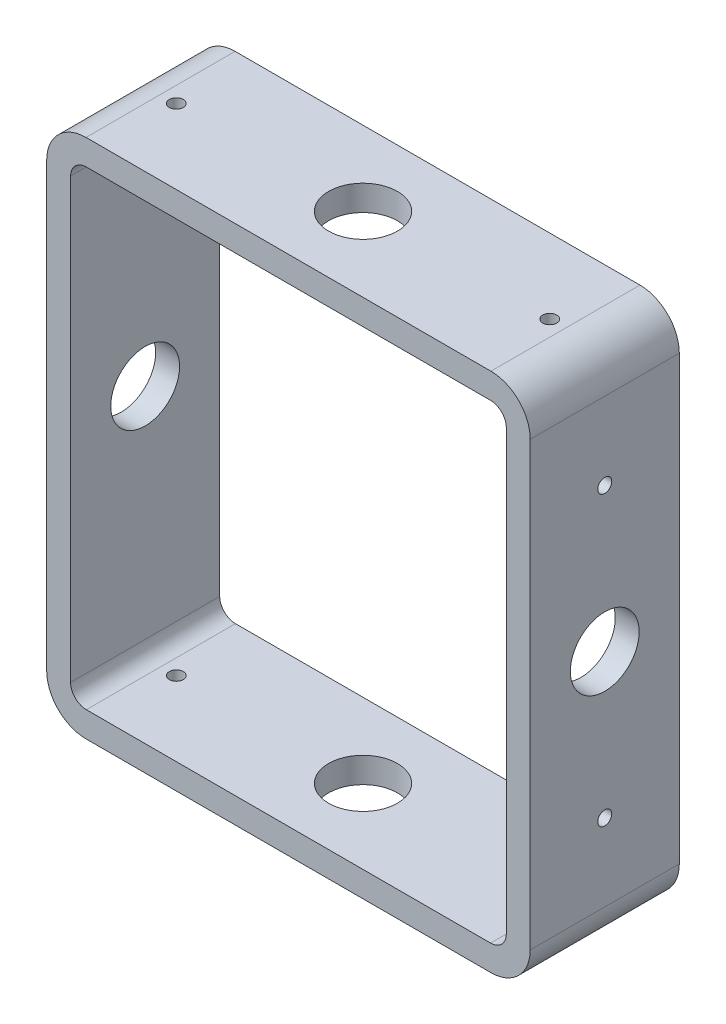
ISO-10303-21;
HEADER;
FILE_DESCRIPTION(('STEP AP214'),'2;1');
FILE_NAME('part.step','',(''),(''),'','','');
FILE_SCHEMA(('AUTOMOTIVE_DESIGN { 1 0 10303 214 1 1 1 1 }'));
ENDSEC;
DATA;
#1=APPLICATION_CONTEXT('core data for automotive mechanical design processes');
#2=APPLICATION_PROTOCOL_DEFINITION('international standard','automotive_design',2000,#1);
#3=PRODUCT_CONTEXT('',#1,'mechanical');
#4=PRODUCT('Part','Part','',(#3));
#5=PRODUCT_RELATED_PRODUCT_CATEGORY('part','',(#4));
#6=PRODUCT_DEFINITION_FORMATION('','',#4);
#7=PRODUCT_DEFINITION_CONTEXT('part definition',#1,'design');
#8=PRODUCT_DEFINITION('design','',#6,#7);
#9=PRODUCT_DEFINITION_SHAPE('','',#8);
#10=(LENGTH_UNIT() NAMED_UNIT(*) SI_UNIT(.MILLI.,.METRE.));
#11=(NAMED_UNIT(*) PLANE_ANGLE_UNIT() SI_UNIT($,.RADIAN.));
#12=(NAMED_UNIT(*) SI_UNIT($,.STERADIAN.) SOLID_ANGLE_UNIT());
#13=UNCERTAINTY_MEASURE_WITH_UNIT(LENGTH_MEASURE(1.E-05),#10,'distance_accuracy_value','');
#14=(GEOMETRIC_REPRESENTATION_CONTEXT(3) GLOBAL_UNCERTAINTY_ASSIGNED_CONTEXT((#13)) GLOBAL_UNIT_ASSIGNED_CONTEXT((#10,
#11,#12)) REPRESENTATION_CONTEXT('',''));
#15=CARTESIAN_POINT('',(0.,0.,0.));
#16=DIRECTION('',(0.,0.,1.));
#17=DIRECTION('',(1.,0.,0.));
#18=AXIS2_PLACEMENT_3D('',#15,#16,#17);
#19=CARTESIAN_POINT('',(-39.0271,-42.04335,24.0665));
#20=DIRECTION('',(0.,1.,0.));
#21=DIRECTION('',(0.,0.,1.));
#22=AXIS2_PLACEMENT_3D('',#19,#20,#21);
#23=PLANE('',#22);
#24=CARTESIAN_POINT('',(30.1371,-42.04335,12.03325));
#25=DIRECTION('',(0.,-1.,0.));
#26=DIRECTION('',(0.,0.,-1.));
#27=AXIS2_PLACEMENT_3D('',#24,#25,#26);
#28=CIRCLE('',#27,1.13029999999999);
#29=CARTESIAN_POINT('',(30.1371,-42.04335,10.90295));
#30=VERTEX_POINT('',#29);
#31=EDGE_CURVE('E554',#30,#30,#28,.T.);
#32=ORIENTED_EDGE('',*,*,#31,.F.);
#33=EDGE_LOOP('',(#32));
#34=FACE_BOUND('',#33,.T.);
#35=CARTESIAN_POINT('',(0.,-42.04335,12.03325));
#36=DIRECTION('',(0.,1.,0.));
#37=DIRECTION('',(0.,0.,1.));
#38=AXIS2_PLACEMENT_3D('',#35,#36,#37);
#39=CIRCLE('',#38,5.55624999999999);
#40=CARTESIAN_POINT('',(0.,-42.04335,17.5895));
#41=VERTEX_POINT('',#40);
#42=EDGE_CURVE('E588',#41,#41,#39,.T.);
#43=ORIENTED_EDGE('',*,*,#42,.T.);
#44=EDGE_LOOP('',(#43));
#45=FACE_BOUND('',#44,.T.);
#46=DIRECTION('',(1.,0.,0.));
#47=VECTOR('',#46,1.);
#48=CARTESIAN_POINT('',(-39.0271,-42.04335,0.));
#49=LINE('',#48,#47);
#50=CARTESIAN_POINT('',(-32.6771,-42.04335,0.));
#51=VERTEX_POINT('',#50);
#52=CARTESIAN_POINT('',(32.6771,-42.04335,0.));
#53=VERTEX_POINT('',#52);
#54=EDGE_CURVE('E201',#51,#53,#49,.T.);
#55=ORIENTED_EDGE('',*,*,#54,.T.);
#56=DIRECTION('',(0.,0.,-1.));
#57=VECTOR('',#56,1.);
#58=CARTESIAN_POINT('',(32.6771,-42.04335,24.0665));
#59=LINE('',#58,#57);
#60=CARTESIAN_POINT('',(32.6771,-42.04335,24.0665));
#61=VERTEX_POINT('',#60);
#62=EDGE_CURVE('E162',#53,#61,#59,.F.);
#63=ORIENTED_EDGE('',*,*,#62,.T.);
#64=DIRECTION('',(1.,0.,0.));
#65=VECTOR('',#64,1.);
#66=CARTESIAN_POINT('',(-39.0271,-42.04335,24.0665));
#67=LINE('',#66,#65);
#68=CARTESIAN_POINT('',(-32.6771,-42.04335,24.0665));
#69=VERTEX_POINT('',#68);
#70=EDGE_CURVE('E196',#69,#61,#67,.T.);
#71=ORIENTED_EDGE('',*,*,#70,.F.);
#72=DIRECTION('',(0.,0.,-1.));
#73=VECTOR('',#72,1.);
#74=CARTESIAN_POINT('',(-32.6771,-42.04335,24.0665));
#75=LINE('',#74,#73);
#76=EDGE_CURVE('E167',#69,#51,#75,.T.);
#77=ORIENTED_EDGE('',*,*,#76,.T.);
#78=EDGE_LOOP('',(#55,#63,#71,#77));
#79=FACE_BOUND('',#78,.T.);
#80=CARTESIAN_POINT('',(-30.1371,-42.04335,12.03325));
#81=DIRECTION('',(0.,-1.,0.));
#82=DIRECTION('',(0.,0.,-1.));
#83=AXIS2_PLACEMENT_3D('',#80,#81,#82);
#84=CIRCLE('',#83,1.13029999999999);
#85=CARTESIAN_POINT('',(-30.1371,-42.04335,10.90295));
#86=VERTEX_POINT('',#85);
#87=EDGE_CURVE('E564',#86,#86,#84,.T.);
#88=ORIENTED_EDGE('',*,*,#87,.F.);
#89=EDGE_LOOP('',(#88));
#90=FACE_BOUND('',#89,.T.);
#91=ADVANCED_FACE('F43',(#34,#45,#79,#90),#23,.F.);
#92=CARTESIAN_POINT('',(39.0271,-42.04335,24.0665));
#93=DIRECTION('',(-1.,0.,0.));
#94=DIRECTION('',(0.,0.,1.));
#95=AXIS2_PLACEMENT_3D('',#92,#93,#94);
#96=PLANE('',#95);
#97=CARTESIAN_POINT('',(39.0271,0.,12.03325));
#98=DIRECTION('',(-1.,0.,0.));
#99=DIRECTION('',(0.,0.,1.));
#100=AXIS2_PLACEMENT_3D('',#97,#98,#99);
#101=CIRCLE('',#100,5.55624999999999);
#102=CARTESIAN_POINT('',(39.0271,0.,17.5895));
#103=VERTEX_POINT('',#102);
#104=EDGE_CURVE('E599',#103,#103,#101,.T.);
#105=ORIENTED_EDGE('',*,*,#104,.T.);
#106=EDGE_LOOP('',(#105));
#107=FACE_BOUND('',#106,.T.);
#108=DIRECTION('',(0.,1.,0.));
#109=VECTOR('',#108,1.);
#110=CARTESIAN_POINT('',(39.0271,-42.04335,24.0665));
#111=LINE('',#110,#109);
#112=CARTESIAN_POINT('',(39.0271,-35.69335,24.0665));
#113=VERTEX_POINT('',#112);
#114=CARTESIAN_POINT('',(39.0271,35.69335,24.0665));
#115=VERTEX_POINT('',#114);
#116=EDGE_CURVE('E178',#113,#115,#111,.T.);
#117=ORIENTED_EDGE('',*,*,#116,.F.);
#118=DIRECTION('',(0.,0.,-1.));
#119=VECTOR('',#118,1.);
#120=CARTESIAN_POINT('',(39.0271,-35.69335,24.0665));
#121=LINE('',#120,#119);
#122=CARTESIAN_POINT('',(39.0271,-35.69335,0.));
#123=VERTEX_POINT('',#122);
#124=EDGE_CURVE('E161',#113,#123,#121,.T.);
#125=ORIENTED_EDGE('',*,*,#124,.T.);
#126=DIRECTION('',(0.,1.,0.));
#127=VECTOR('',#126,1.);
#128=CARTESIAN_POINT('',(39.0271,-42.04335,0.));
#129=LINE('',#128,#127);
#130=CARTESIAN_POINT('',(39.0271,35.69335,0.));
#131=VERTEX_POINT('',#130);
#132=EDGE_CURVE('E175',#123,#131,#129,.T.);
#133=ORIENTED_EDGE('',*,*,#132,.T.);
#134=DIRECTION('',(0.,0.,-1.));
#135=VECTOR('',#134,1.);
#136=CARTESIAN_POINT('',(39.0271,35.69335,24.0665));
#137=LINE('',#136,#135);
#138=EDGE_CURVE('E180',#131,#115,#137,.F.);
#139=ORIENTED_EDGE('',*,*,#138,.T.);
#140=EDGE_LOOP('',(#117,#125,#133,#139));
#141=FACE_BOUND('',#140,.T.);
#142=CARTESIAN_POINT('',(39.0271,-23.241,12.03325));
#143=DIRECTION('',(1.,0.,0.));
#144=DIRECTION('',(0.,0.,-1.));
#145=AXIS2_PLACEMENT_3D('',#142,#143,#144);
#146=CIRCLE('',#145,1.13029999999998);
#147=CARTESIAN_POINT('',(39.0271,-23.241,10.90295));
#148=VERTEX_POINT('',#147);
#149=EDGE_CURVE('E579',#148,#148,#146,.T.);
#150=ORIENTED_EDGE('',*,*,#149,.F.);
#151=EDGE_LOOP('',(#150));
#152=FACE_BOUND('',#151,.T.);
#153=CARTESIAN_POINT('',(39.0271,23.241,12.03325));
#154=DIRECTION('',(1.,0.,0.));
#155=DIRECTION('',(0.,0.,-1.));
#156=AXIS2_PLACEMENT_3D('',#153,#154,#155);
#157=CIRCLE('',#156,1.13029999999998);
#158=CARTESIAN_POINT('',(39.0271,23.241,10.90295));
#159=VERTEX_POINT('',#158);
#160=EDGE_CURVE('E573',#159,#159,#157,.T.);
#161=ORIENTED_EDGE('',*,*,#160,.F.);
#162=EDGE_LOOP('',(#161));
#163=FACE_BOUND('',#162,.T.);
#164=ADVANCED_FACE('F173',(#107,#141,#152,#163),#96,.F.);
#165=CARTESIAN_POINT('',(0.,0.,24.0665));
#166=DIRECTION('',(0.,0.,-1.));
#167=DIRECTION('',(-1.,0.,0.));
#168=AXIS2_PLACEMENT_3D('',#165,#166,#167);
#169=PLANE('',#168);
#170=ORIENTED_EDGE('',*,*,#70,.T.);
#171=CARTESIAN_POINT('',(32.6771,-35.69335,24.0665));
#172=DIRECTION('',(0.,0.,-1.));
#173=DIRECTION('',(-1.,0.,0.));
#174=AXIS2_PLACEMENT_3D('',#171,#172,#173);
#175=CIRCLE('',#174,6.35);
#176=EDGE_CURVE('E216',#61,#113,#175,.F.);
#177=ORIENTED_EDGE('',*,*,#176,.T.);
#178=ORIENTED_EDGE('',*,*,#116,.T.);
#179=CARTESIAN_POINT('',(32.6771,35.69335,24.0665));
#180=DIRECTION('',(0.,0.,-1.));
#181=DIRECTION('',(-1.,0.,0.));
#182=AXIS2_PLACEMENT_3D('',#179,#180,#181);
#183=CIRCLE('',#182,6.35);
#184=CARTESIAN_POINT('',(32.6771,42.04335,24.0665));
#185=VERTEX_POINT('',#184);
#186=EDGE_CURVE('E212',#115,#185,#183,.F.);
#187=ORIENTED_EDGE('',*,*,#186,.T.);
#188=DIRECTION('',(-1.,0.,0.));
#189=VECTOR('',#188,1.);
#190=CARTESIAN_POINT('',(-39.0271,42.04335,24.0665));
#191=LINE('',#190,#189);
#192=CARTESIAN_POINT('',(-32.6771,42.04335,24.0665));
#193=VERTEX_POINT('',#192);
#194=EDGE_CURVE('E292',#185,#193,#191,.T.);
#195=ORIENTED_EDGE('',*,*,#194,.T.);
#196=CARTESIAN_POINT('',(-32.6771,35.69335,24.0665));
#197=DIRECTION('',(0.,0.,-1.));
#198=DIRECTION('',(-1.,0.,0.));
#199=AXIS2_PLACEMENT_3D('',#196,#197,#198);
#200=CIRCLE('',#199,6.35);
#201=CARTESIAN_POINT('',(-39.0271,35.69335,24.0665));
#202=VERTEX_POINT('',#201);
#203=EDGE_CURVE('E210',#193,#202,#200,.F.);
#204=ORIENTED_EDGE('',*,*,#203,.T.);
#205=DIRECTION('',(0.,-1.,0.));
#206=VECTOR('',#205,1.);
#207=CARTESIAN_POINT('',(-39.0271,-42.04335,24.0665));
#208=LINE('',#207,#206);
#209=CARTESIAN_POINT('',(-39.0271,-35.69335,24.0665));
#210=VERTEX_POINT('',#209);
#211=EDGE_CURVE('E294',#202,#210,#208,.T.);
#212=ORIENTED_EDGE('',*,*,#211,.T.);
#213=CARTESIAN_POINT('',(-32.6771,-35.69335,24.0665));
#214=DIRECTION('',(0.,0.,-1.));
#215=DIRECTION('',(-1.,0.,0.));
#216=AXIS2_PLACEMENT_3D('',#213,#214,#215);
#217=CIRCLE('',#216,6.35);
#218=EDGE_CURVE('E214',#210,#69,#217,.F.);
#219=ORIENTED_EDGE('',*,*,#218,.T.);
#220=EDGE_LOOP('',(#170,#177,#178,#187,#195,#204,#212,#219));
#221=FACE_BOUND('',#220,.T.);
#222=DIRECTION('',(0.,1.,0.));
#223=VECTOR('',#222,1.);
#224=CARTESIAN_POINT('',(35.1663,-37.9349,24.0665));
#225=LINE('',#224,#223);
#226=CARTESIAN_POINT('',(35.1663,-35.3949,24.0665));
#227=VERTEX_POINT('',#226);
#228=CARTESIAN_POINT('',(35.1663,35.3949,24.0665));
#229=VERTEX_POINT('',#228);
#230=EDGE_CURVE('E275',#227,#229,#225,.T.);
#231=ORIENTED_EDGE('',*,*,#230,.F.);
#232=CARTESIAN_POINT('',(32.6263,-35.3949,24.0665));
#233=DIRECTION('',(0.,0.,-1.));
#234=DIRECTION('',(-1.,0.,0.));
#235=AXIS2_PLACEMENT_3D('',#232,#233,#234);
#236=CIRCLE('',#235,2.54);
#237=CARTESIAN_POINT('',(32.6263,-37.9349,24.0665));
#238=VERTEX_POINT('',#237);
#239=EDGE_CURVE('E257',#227,#238,#236,.T.);
#240=ORIENTED_EDGE('',*,*,#239,.T.);
#241=DIRECTION('',(1.,0.,0.));
#242=VECTOR('',#241,1.);
#243=CARTESIAN_POINT('',(-35.1663,-37.9349,24.0665));
#244=LINE('',#243,#242);
#245=CARTESIAN_POINT('',(-32.6263,-37.9349,24.0665));
#246=VERTEX_POINT('',#245);
#247=EDGE_CURVE('E187',#246,#238,#244,.T.);
#248=ORIENTED_EDGE('',*,*,#247,.F.);
#249=CARTESIAN_POINT('',(-32.6263,-35.3949,24.0665));
#250=DIRECTION('',(0.,0.,-1.));
#251=DIRECTION('',(-1.,0.,0.));
#252=AXIS2_PLACEMENT_3D('',#249,#250,#251);
#253=CIRCLE('',#252,2.54);
#254=CARTESIAN_POINT('',(-35.1663,-35.3949,24.0665));
#255=VERTEX_POINT('',#254);
#256=EDGE_CURVE('E249',#246,#255,#253,.T.);
#257=ORIENTED_EDGE('',*,*,#256,.T.);
#258=DIRECTION('',(0.,-1.,0.));
#259=VECTOR('',#258,1.);
#260=CARTESIAN_POINT('',(-35.1663,-37.9349,24.0665));
#261=LINE('',#260,#259);
#262=CARTESIAN_POINT('',(-35.1663,35.3949,24.0665));
#263=VERTEX_POINT('',#262);
#264=EDGE_CURVE('E193',#263,#255,#261,.T.);
#265=ORIENTED_EDGE('',*,*,#264,.F.);
#266=CARTESIAN_POINT('',(-32.6263,35.3949,24.0665));
#267=DIRECTION('',(0.,0.,-1.));
#268=DIRECTION('',(-1.,0.,0.));
#269=AXIS2_PLACEMENT_3D('',#266,#267,#268);
#270=CIRCLE('',#269,2.54);
#271=CARTESIAN_POINT('',(-32.6263,37.9349,24.0665));
#272=VERTEX_POINT('',#271);
#273=EDGE_CURVE('E253',#263,#272,#270,.T.);
#274=ORIENTED_EDGE('',*,*,#273,.T.);
#275=DIRECTION('',(-1.,0.,0.));
#276=VECTOR('',#275,1.);
#277=CARTESIAN_POINT('',(-35.1663,37.9349,24.0665));
#278=LINE('',#277,#276);
#279=CARTESIAN_POINT('',(32.6263,37.9349,24.0665));
#280=VERTEX_POINT('',#279);
#281=EDGE_CURVE('E277',#280,#272,#278,.T.);
#282=ORIENTED_EDGE('',*,*,#281,.F.);
#283=CARTESIAN_POINT('',(32.6263,35.3949,24.0665));
#284=DIRECTION('',(0.,0.,-1.));
#285=DIRECTION('',(-1.,0.,0.));
#286=AXIS2_PLACEMENT_3D('',#283,#284,#285);
#287=CIRCLE('',#286,2.54);
#288=EDGE_CURVE('E11',#280,#229,#287,.T.);
#289=ORIENTED_EDGE('',*,*,#288,.T.);
#290=EDGE_LOOP('',(#231,#240,#248,#257,#265,#274,#282,#289));
#291=FACE_BOUND('',#290,.T.);
#292=ADVANCED_FACE('F301',(#221,#291),#169,.F.);
#293=CARTESIAN_POINT('',(0.,0.,0.));
#294=DIRECTION('',(0.,0.,-1.));
#295=DIRECTION('',(-1.,0.,0.));
#296=AXIS2_PLACEMENT_3D('',#293,#294,#295);
#297=PLANE('',#296);
#298=ORIENTED_EDGE('',*,*,#132,.F.);
#299=CARTESIAN_POINT('',(32.6771,-35.69335,0.));
#300=DIRECTION('',(0.,0.,-1.));
#301=DIRECTION('',(-1.,0.,0.));
#302=AXIS2_PLACEMENT_3D('',#299,#300,#301);
#303=CIRCLE('',#302,6.35);
#304=EDGE_CURVE('E157',#123,#53,#303,.T.);
#305=ORIENTED_EDGE('',*,*,#304,.T.);
#306=ORIENTED_EDGE('',*,*,#54,.F.);
#307=CARTESIAN_POINT('',(-32.6771,-35.69335,0.));
#308=DIRECTION('',(0.,0.,-1.));
#309=DIRECTION('',(-1.,0.,0.));
#310=AXIS2_PLACEMENT_3D('',#307,#308,#309);
#311=CIRCLE('',#310,6.35);
#312=CARTESIAN_POINT('',(-39.0271,-35.69335,0.));
#313=VERTEX_POINT('',#312);
#314=EDGE_CURVE('E168',#51,#313,#311,.T.);
#315=ORIENTED_EDGE('',*,*,#314,.T.);
#316=DIRECTION('',(0.,-1.,0.));
#317=VECTOR('',#316,1.);
#318=CARTESIAN_POINT('',(-39.0271,-42.04335,0.));
#319=LINE('',#318,#317);
#320=CARTESIAN_POINT('',(-39.0271,35.69335,0.));
#321=VERTEX_POINT('',#320);
#322=EDGE_CURVE('E190',#321,#313,#319,.T.);
#323=ORIENTED_EDGE('',*,*,#322,.F.);
#324=CARTESIAN_POINT('',(-32.6771,35.69335,0.));
#325=DIRECTION('',(0.,0.,-1.));
#326=DIRECTION('',(-1.,0.,0.));
#327=AXIS2_PLACEMENT_3D('',#324,#325,#326);
#328=CIRCLE('',#327,6.35);
#329=CARTESIAN_POINT('',(-32.6771,42.04335,0.));
#330=VERTEX_POINT('',#329);
#331=EDGE_CURVE('E179',#321,#330,#328,.T.);
#332=ORIENTED_EDGE('',*,*,#331,.T.);
#333=DIRECTION('',(-1.,0.,0.));
#334=VECTOR('',#333,1.);
#335=CARTESIAN_POINT('',(-39.0271,42.04335,0.));
#336=LINE('',#335,#334);
#337=CARTESIAN_POINT('',(32.6771,42.04335,0.));
#338=VERTEX_POINT('',#337);
#339=EDGE_CURVE('E186',#338,#330,#336,.T.);
#340=ORIENTED_EDGE('',*,*,#339,.F.);
#341=CARTESIAN_POINT('',(32.6771,35.69335,0.));
#342=DIRECTION('',(0.,0.,-1.));
#343=DIRECTION('',(-1.,0.,0.));
#344=AXIS2_PLACEMENT_3D('',#341,#342,#343);
#345=CIRCLE('',#344,6.35);
#346=EDGE_CURVE('E185',#338,#131,#345,.T.);
#347=ORIENTED_EDGE('',*,*,#346,.T.);
#348=EDGE_LOOP('',(#298,#305,#306,#315,#323,#332,#340,#347));
#349=FACE_BOUND('',#348,.T.);
#350=DIRECTION('',(0.,-1.,0.));
#351=VECTOR('',#350,1.);
#352=CARTESIAN_POINT('',(-35.1663,-37.9349,0.));
#353=LINE('',#352,#351);
#354=CARTESIAN_POINT('',(-35.1663,35.3949,0.));
#355=VERTEX_POINT('',#354);
#356=CARTESIAN_POINT('',(-35.1663,-35.3949,0.));
#357=VERTEX_POINT('',#356);
#358=EDGE_CURVE('E272',#355,#357,#353,.T.);
#359=ORIENTED_EDGE('',*,*,#358,.T.);
#360=CARTESIAN_POINT('',(-32.6263,-35.3949,0.));
#361=DIRECTION('',(0.,0.,-1.));
#362=DIRECTION('',(-1.,0.,0.));
#363=AXIS2_PLACEMENT_3D('',#360,#361,#362);
#364=CIRCLE('',#363,2.54);
#365=CARTESIAN_POINT('',(-32.6263,-37.9349,0.));
#366=VERTEX_POINT('',#365);
#367=EDGE_CURVE('E247',#357,#366,#364,.F.);
#368=ORIENTED_EDGE('',*,*,#367,.T.);
#369=DIRECTION('',(1.,0.,0.));
#370=VECTOR('',#369,1.);
#371=CARTESIAN_POINT('',(-35.1663,-37.9349,0.));
#372=LINE('',#371,#370);
#373=CARTESIAN_POINT('',(32.6263,-37.9349,0.));
#374=VERTEX_POINT('',#373);
#375=EDGE_CURVE('E278',#366,#374,#372,.T.);
#376=ORIENTED_EDGE('',*,*,#375,.T.);
#377=CARTESIAN_POINT('',(32.6263,-35.3949,0.));
#378=DIRECTION('',(0.,0.,-1.));
#379=DIRECTION('',(-1.,0.,0.));
#380=AXIS2_PLACEMENT_3D('',#377,#378,#379);
#381=CIRCLE('',#380,2.54);
#382=CARTESIAN_POINT('',(35.1663,-35.3949,0.));
#383=VERTEX_POINT('',#382);
#384=EDGE_CURVE('E255',#374,#383,#381,.F.);
#385=ORIENTED_EDGE('',*,*,#384,.T.);
#386=DIRECTION('',(0.,1.,0.));
#387=VECTOR('',#386,1.);
#388=CARTESIAN_POINT('',(35.1663,-37.9349,0.));
#389=LINE('',#388,#387);
#390=CARTESIAN_POINT('',(35.1663,35.3949,0.));
#391=VERTEX_POINT('',#390);
#392=EDGE_CURVE('E264',#383,#391,#389,.T.);
#393=ORIENTED_EDGE('',*,*,#392,.T.);
#394=CARTESIAN_POINT('',(32.6263,35.3949,0.));
#395=DIRECTION('',(0.,0.,-1.));
#396=DIRECTION('',(-1.,0.,0.));
#397=AXIS2_PLACEMENT_3D('',#394,#395,#396);
#398=CIRCLE('',#397,2.54);
#399=CARTESIAN_POINT('',(32.6263,37.9349,0.));
#400=VERTEX_POINT('',#399);
#401=EDGE_CURVE('E52',#391,#400,#398,.F.);
#402=ORIENTED_EDGE('',*,*,#401,.T.);
#403=DIRECTION('',(-1.,0.,0.));
#404=VECTOR('',#403,1.);
#405=CARTESIAN_POINT('',(-35.1663,37.9349,0.));
#406=LINE('',#405,#404);
#407=CARTESIAN_POINT('',(-32.6263,37.9349,0.));
#408=VERTEX_POINT('',#407);
#409=EDGE_CURVE('E263',#400,#408,#406,.T.);
#410=ORIENTED_EDGE('',*,*,#409,.T.);
#411=CARTESIAN_POINT('',(-32.6263,35.3949,0.));
#412=DIRECTION('',(0.,0.,-1.));
#413=DIRECTION('',(-1.,0.,0.));
#414=AXIS2_PLACEMENT_3D('',#411,#412,#413);
#415=CIRCLE('',#414,2.54);
#416=EDGE_CURVE('E251',#408,#355,#415,.F.);
#417=ORIENTED_EDGE('',*,*,#416,.T.);
#418=EDGE_LOOP('',(#359,#368,#376,#385,#393,#402,#410,#417));
#419=FACE_BOUND('',#418,.T.);
#420=ADVANCED_FACE('F182',(#349,#419),#297,.T.);
#421=CARTESIAN_POINT('',(-39.0271,42.04335,24.0665));
#422=DIRECTION('',(0.,-1.,0.));
#423=DIRECTION('',(0.,0.,-1.));
#424=AXIS2_PLACEMENT_3D('',#421,#422,#423);
#425=PLANE('',#424);
#426=CARTESIAN_POINT('',(30.1371,42.04335,12.03325));
#427=DIRECTION('',(0.,-1.,0.));
#428=DIRECTION('',(0.,0.,-1.));
#429=AXIS2_PLACEMENT_3D('',#426,#427,#428);
#430=CIRCLE('',#429,1.13029999999998);
#431=CARTESIAN_POINT('',(30.1371,42.04335,10.90295));
#432=VERTEX_POINT('',#431);
#433=EDGE_CURVE('E555',#432,#432,#430,.T.);
#434=ORIENTED_EDGE('',*,*,#433,.T.);
#435=EDGE_LOOP('',(#434));
#436=FACE_BOUND('',#435,.T.);
#437=CARTESIAN_POINT('',(-30.1371,42.04335,12.03325));
#438=DIRECTION('',(0.,-1.,0.));
#439=DIRECTION('',(0.,0.,-1.));
#440=AXIS2_PLACEMENT_3D('',#437,#438,#439);
#441=CIRCLE('',#440,1.13029999999998);
#442=CARTESIAN_POINT('',(-30.1371,42.04335,10.90295));
#443=VERTEX_POINT('',#442);
#444=EDGE_CURVE('E567',#443,#443,#441,.T.);
#445=ORIENTED_EDGE('',*,*,#444,.T.);
#446=EDGE_LOOP('',(#445));
#447=FACE_BOUND('',#446,.T.);
#448=CARTESIAN_POINT('',(0.,42.04335,12.03325));
#449=DIRECTION('',(0.,1.,0.));
#450=DIRECTION('',(0.,0.,1.));
#451=AXIS2_PLACEMENT_3D('',#448,#449,#450);
#452=CIRCLE('',#451,5.55624999999999);
#453=CARTESIAN_POINT('',(0.,42.04335,17.5895));
#454=VERTEX_POINT('',#453);
#455=EDGE_CURVE('E585',#454,#454,#452,.T.);
#456=ORIENTED_EDGE('',*,*,#455,.F.);
#457=EDGE_LOOP('',(#456));
#458=FACE_BOUND('',#457,.T.);
#459=ORIENTED_EDGE('',*,*,#194,.F.);
#460=DIRECTION('',(0.,0.,-1.));
#461=VECTOR('',#460,1.);
#462=CARTESIAN_POINT('',(32.6771,42.04335,24.0665));
#463=LINE('',#462,#461);
#464=EDGE_CURVE('E225',#185,#338,#463,.T.);
#465=ORIENTED_EDGE('',*,*,#464,.T.);
#466=ORIENTED_EDGE('',*,*,#339,.T.);
#467=DIRECTION('',(0.,0.,-1.));
#468=VECTOR('',#467,1.);
#469=CARTESIAN_POINT('',(-32.6771,42.04335,24.0665));
#470=LINE('',#469,#468);
#471=EDGE_CURVE('E223',#330,#193,#470,.F.);
#472=ORIENTED_EDGE('',*,*,#471,.T.);
#473=EDGE_LOOP('',(#459,#465,#466,#472));
#474=FACE_BOUND('',#473,.T.);
#475=ADVANCED_FACE('F318',(#436,#447,#458,#474),#425,.F.);
#476=CARTESIAN_POINT('',(-39.0271,-42.04335,24.0665));
#477=DIRECTION('',(1.,0.,0.));
#478=DIRECTION('',(0.,0.,-1.));
#479=AXIS2_PLACEMENT_3D('',#476,#477,#478);
#480=PLANE('',#479);
#481=CARTESIAN_POINT('',(-39.0271,0.,12.03325));
#482=DIRECTION('',(-1.,0.,0.));
#483=DIRECTION('',(0.,0.,1.));
#484=AXIS2_PLACEMENT_3D('',#481,#482,#483);
#485=CIRCLE('',#484,5.55624999999999);
#486=CARTESIAN_POINT('',(-39.0271,0.,17.5895));
#487=VERTEX_POINT('',#486);
#488=EDGE_CURVE('E596',#487,#487,#485,.T.);
#489=ORIENTED_EDGE('',*,*,#488,.F.);
#490=EDGE_LOOP('',(#489));
#491=FACE_BOUND('',#490,.T.);
#492=ORIENTED_EDGE('',*,*,#322,.T.);
#493=DIRECTION('',(0.,0.,-1.));
#494=VECTOR('',#493,1.);
#495=CARTESIAN_POINT('',(-39.0271,-35.69335,24.0665));
#496=LINE('',#495,#494);
#497=EDGE_CURVE('E221',#313,#210,#496,.F.);
#498=ORIENTED_EDGE('',*,*,#497,.T.);
#499=ORIENTED_EDGE('',*,*,#211,.F.);
#500=DIRECTION('',(0.,0.,-1.));
#501=VECTOR('',#500,1.);
#502=CARTESIAN_POINT('',(-39.0271,35.69335,24.0665));
#503=LINE('',#502,#501);
#504=EDGE_CURVE('E218',#202,#321,#503,.T.);
#505=ORIENTED_EDGE('',*,*,#504,.T.);
#506=EDGE_LOOP('',(#492,#498,#499,#505));
#507=FACE_BOUND('',#506,.T.);
#508=ADVANCED_FACE('F310',(#491,#507),#480,.F.);
#509=CARTESIAN_POINT('',(35.1663,-37.9349,24.0665));
#510=DIRECTION('',(-1.,0.,0.));
#511=DIRECTION('',(0.,0.,1.));
#512=AXIS2_PLACEMENT_3D('',#509,#510,#511);
#513=PLANE('',#512);
#514=CARTESIAN_POINT('',(35.1663,23.241,12.03325));
#515=DIRECTION('',(-1.,0.,0.));
#516=DIRECTION('',(0.,0.,1.));
#517=AXIS2_PLACEMENT_3D('',#514,#515,#516);
#518=CIRCLE('',#517,1.13029999999999);
#519=CARTESIAN_POINT('',(35.1663,23.241,13.16355));
#520=VERTEX_POINT('',#519);
#521=EDGE_CURVE('E576',#520,#520,#518,.T.);
#522=ORIENTED_EDGE('',*,*,#521,.F.);
#523=EDGE_LOOP('',(#522));
#524=FACE_BOUND('',#523,.T.);
#525=CARTESIAN_POINT('',(35.1663,-23.241,12.03325));
#526=DIRECTION('',(-1.,0.,0.));
#527=DIRECTION('',(0.,0.,1.));
#528=AXIS2_PLACEMENT_3D('',#525,#526,#527);
#529=CIRCLE('',#528,1.13029999999999);
#530=CARTESIAN_POINT('',(35.1663,-23.241,13.16355));
#531=VERTEX_POINT('',#530);
#532=EDGE_CURVE('E582',#531,#531,#529,.T.);
#533=ORIENTED_EDGE('',*,*,#532,.F.);
#534=EDGE_LOOP('',(#533));
#535=FACE_BOUND('',#534,.T.);
#536=CARTESIAN_POINT('',(35.1663,0.,12.03325));
#537=DIRECTION('',(-1.,0.,0.));
#538=DIRECTION('',(0.,0.,1.));
#539=AXIS2_PLACEMENT_3D('',#536,#537,#538);
#540=CIRCLE('',#539,5.55624999999999);
#541=CARTESIAN_POINT('',(35.1663,0.,17.5895));
#542=VERTEX_POINT('',#541);
#543=EDGE_CURVE('E601',#542,#542,#540,.T.);
#544=ORIENTED_EDGE('',*,*,#543,.F.);
#545=EDGE_LOOP('',(#544));
#546=FACE_BOUND('',#545,.T.);
#547=ORIENTED_EDGE('',*,*,#392,.F.);
#548=DIRECTION('',(0.,0.,-1.));
#549=VECTOR('',#548,1.);
#550=CARTESIAN_POINT('',(35.1663,-35.3949,24.0665));
#551=LINE('',#550,#549);
#552=EDGE_CURVE('E64',#383,#227,#551,.F.);
#553=ORIENTED_EDGE('',*,*,#552,.T.);
#554=ORIENTED_EDGE('',*,*,#230,.T.);
#555=DIRECTION('',(0.,0.,-1.));
#556=VECTOR('',#555,1.);
#557=CARTESIAN_POINT('',(35.1663,35.3949,0.));
#558=LINE('',#557,#556);
#559=EDGE_CURVE('E243',#229,#391,#558,.T.);
#560=ORIENTED_EDGE('',*,*,#559,.T.);
#561=EDGE_LOOP('',(#547,#553,#554,#560));
#562=FACE_BOUND('',#561,.T.);
#563=ADVANCED_FACE('F274',(#524,#535,#546,#562),#513,.T.);
#564=CARTESIAN_POINT('',(-35.1663,37.9349,24.0665));
#565=DIRECTION('',(0.,-1.,0.));
#566=DIRECTION('',(0.,0.,-1.));
#567=AXIS2_PLACEMENT_3D('',#564,#565,#566);
#568=PLANE('',#567);
#569=CARTESIAN_POINT('',(30.1371,37.9349,12.03325));
#570=DIRECTION('',(0.,-1.,0.));
#571=DIRECTION('',(0.,0.,-1.));
#572=AXIS2_PLACEMENT_3D('',#569,#570,#571);
#573=CIRCLE('',#572,1.13029999999998);
#574=CARTESIAN_POINT('',(30.1371,37.9349,10.90295));
#575=VERTEX_POINT('',#574);
#576=EDGE_CURVE('E561',#575,#575,#573,.T.);
#577=ORIENTED_EDGE('',*,*,#576,.F.);
#578=EDGE_LOOP('',(#577));
#579=FACE_BOUND('',#578,.T.);
#580=CARTESIAN_POINT('',(-30.1371,37.9349,12.03325));
#581=DIRECTION('',(0.,-1.,0.));
#582=DIRECTION('',(0.,0.,-1.));
#583=AXIS2_PLACEMENT_3D('',#580,#581,#582);
#584=CIRCLE('',#583,1.13029999999999);
#585=CARTESIAN_POINT('',(-30.1371,37.9349,10.90295));
#586=VERTEX_POINT('',#585);
#587=EDGE_CURVE('E570',#586,#586,#584,.T.);
#588=ORIENTED_EDGE('',*,*,#587,.F.);
#589=EDGE_LOOP('',(#588));
#590=FACE_BOUND('',#589,.T.);
#591=CARTESIAN_POINT('',(0.,37.9349,12.03325));
#592=DIRECTION('',(0.,-1.,0.));
#593=DIRECTION('',(0.,0.,-1.));
#594=AXIS2_PLACEMENT_3D('',#591,#592,#593);
#595=CIRCLE('',#594,5.55624999999999);
#596=CARTESIAN_POINT('',(0.,37.9349,6.47700000000001));
#597=VERTEX_POINT('',#596);
#598=EDGE_CURVE('E591',#597,#597,#595,.T.);
#599=ORIENTED_EDGE('',*,*,#598,.F.);
#600=EDGE_LOOP('',(#599));
#601=FACE_BOUND('',#600,.T.);
#602=ORIENTED_EDGE('',*,*,#281,.T.);
#603=DIRECTION('',(0.,0.,-1.));
#604=VECTOR('',#603,1.);
#605=CARTESIAN_POINT('',(-32.6263,37.9349,0.));
#606=LINE('',#605,#604);
#607=EDGE_CURVE('E240',#272,#408,#606,.T.);
#608=ORIENTED_EDGE('',*,*,#607,.T.);
#609=ORIENTED_EDGE('',*,*,#409,.F.);
#610=DIRECTION('',(0.,0.,-1.));
#611=VECTOR('',#610,1.);
#612=CARTESIAN_POINT('',(32.6263,37.9349,24.0665));
#613=LINE('',#612,#611);
#614=EDGE_CURVE('E238',#400,#280,#613,.F.);
#615=ORIENTED_EDGE('',*,*,#614,.T.);
#616=EDGE_LOOP('',(#602,#608,#609,#615));
#617=FACE_BOUND('',#616,.T.);
#618=ADVANCED_FACE('F270',(#579,#590,#601,#617),#568,.T.);
#619=CARTESIAN_POINT('',(-35.1663,-37.9349,24.0665));
#620=DIRECTION('',(1.,0.,0.));
#621=DIRECTION('',(0.,0.,-1.));
#622=AXIS2_PLACEMENT_3D('',#619,#620,#621);
#623=PLANE('',#622);
#624=CARTESIAN_POINT('',(-35.1663,0.,12.03325));
#625=DIRECTION('',(1.,0.,0.));
#626=DIRECTION('',(0.,0.,-1.));
#627=AXIS2_PLACEMENT_3D('',#624,#625,#626);
#628=CIRCLE('',#627,5.55624999999999);
#629=CARTESIAN_POINT('',(-35.1663,0.,6.47700000000001));
#630=VERTEX_POINT('',#629);
#631=EDGE_CURVE('E284',#630,#630,#628,.T.);
#632=ORIENTED_EDGE('',*,*,#631,.F.);
#633=EDGE_LOOP('',(#632));
#634=FACE_BOUND('',#633,.T.);
#635=ORIENTED_EDGE('',*,*,#264,.T.);
#636=DIRECTION('',(0.,0.,-1.));
#637=VECTOR('',#636,1.);
#638=CARTESIAN_POINT('',(-35.1663,-35.3949,0.));
#639=LINE('',#638,#637);
#640=EDGE_CURVE('E230',#255,#357,#639,.T.);
#641=ORIENTED_EDGE('',*,*,#640,.T.);
#642=ORIENTED_EDGE('',*,*,#358,.F.);
#643=DIRECTION('',(0.,0.,-1.));
#644=VECTOR('',#643,1.);
#645=CARTESIAN_POINT('',(-35.1663,35.3949,24.0665));
#646=LINE('',#645,#644);
#647=EDGE_CURVE('E228',#355,#263,#646,.F.);
#648=ORIENTED_EDGE('',*,*,#647,.T.);
#649=EDGE_LOOP('',(#635,#641,#642,#648));
#650=FACE_BOUND('',#649,.T.);
#651=ADVANCED_FACE('F378',(#634,#650),#623,.T.);
#652=CARTESIAN_POINT('',(-35.1663,-37.9349,24.0665));
#653=DIRECTION('',(0.,1.,0.));
#654=DIRECTION('',(0.,0.,1.));
#655=AXIS2_PLACEMENT_3D('',#652,#653,#654);
#656=PLANE('',#655);
#657=CARTESIAN_POINT('',(30.1371,-37.9349,12.03325));
#658=DIRECTION('',(0.,1.,0.));
#659=DIRECTION('',(0.,0.,1.));
#660=AXIS2_PLACEMENT_3D('',#657,#658,#659);
#661=CIRCLE('',#660,1.13029999999998);
#662=CARTESIAN_POINT('',(30.1371,-37.9349,13.16355));
#663=VERTEX_POINT('',#662);
#664=EDGE_CURVE('E552',#663,#663,#661,.T.);
#665=ORIENTED_EDGE('',*,*,#664,.F.);
#666=EDGE_LOOP('',(#665));
#667=FACE_BOUND('',#666,.T.);
#668=CARTESIAN_POINT('',(-30.1371,-37.9349,12.03325));
#669=DIRECTION('',(0.,1.,0.));
#670=DIRECTION('',(0.,0.,1.));
#671=AXIS2_PLACEMENT_3D('',#668,#669,#670);
#672=CIRCLE('',#671,1.13029999999999);
#673=CARTESIAN_POINT('',(-30.1371,-37.9349,13.16355));
#674=VERTEX_POINT('',#673);
#675=EDGE_CURVE('E47',#674,#674,#672,.T.);
#676=ORIENTED_EDGE('',*,*,#675,.F.);
#677=EDGE_LOOP('',(#676));
#678=FACE_BOUND('',#677,.T.);
#679=CARTESIAN_POINT('',(0.,-37.9349,12.03325));
#680=DIRECTION('',(0.,1.,0.));
#681=DIRECTION('',(0.,0.,1.));
#682=AXIS2_PLACEMENT_3D('',#679,#680,#681);
#683=CIRCLE('',#682,5.55624999999999);
#684=CARTESIAN_POINT('',(0.,-37.9349,17.5895));
#685=VERTEX_POINT('',#684);
#686=EDGE_CURVE('E593',#685,#685,#683,.T.);
#687=ORIENTED_EDGE('',*,*,#686,.F.);
#688=EDGE_LOOP('',(#687));
#689=FACE_BOUND('',#688,.T.);
#690=ORIENTED_EDGE('',*,*,#375,.F.);
#691=DIRECTION('',(0.,0.,-1.));
#692=VECTOR('',#691,1.);
#693=CARTESIAN_POINT('',(-32.6263,-37.9349,24.0665));
#694=LINE('',#693,#692);
#695=EDGE_CURVE('E236',#366,#246,#694,.F.);
#696=ORIENTED_EDGE('',*,*,#695,.T.);
#697=ORIENTED_EDGE('',*,*,#247,.T.);
#698=DIRECTION('',(0.,0.,-1.));
#699=VECTOR('',#698,1.);
#700=CARTESIAN_POINT('',(32.6263,-37.9349,0.));
#701=LINE('',#700,#699);
#702=EDGE_CURVE('E233',#238,#374,#701,.T.);
#703=ORIENTED_EDGE('',*,*,#702,.T.);
#704=EDGE_LOOP('',(#690,#696,#697,#703));
#705=FACE_BOUND('',#704,.T.);
#706=ADVANCED_FACE('F375',(#667,#678,#689,#705),#656,.T.);
#707=CARTESIAN_POINT('',(-39.0271,0.,12.03325));
#708=DIRECTION('',(-1.,0.,0.));
#709=DIRECTION('',(0.,0.,1.));
#710=AXIS2_PLACEMENT_3D('',#707,#708,#709);
#711=CYLINDRICAL_SURFACE('',#710,5.55624999999999);
#712=ORIENTED_EDGE('',*,*,#631,.T.);
#713=EDGE_LOOP('',(#712));
#714=FACE_BOUND('',#713,.T.);
#715=ORIENTED_EDGE('',*,*,#488,.T.);
#716=EDGE_LOOP('',(#715));
#717=FACE_BOUND('',#716,.T.);
#718=ADVANCED_FACE('F373',(#714,#717),#711,.F.);
#719=ORIENTED_EDGE('',*,*,#543,.T.);
#720=EDGE_LOOP('',(#719));
#721=FACE_BOUND('',#720,.T.);
#722=ORIENTED_EDGE('',*,*,#104,.F.);
#723=EDGE_LOOP('',(#722));
#724=FACE_BOUND('',#723,.T.);
#725=ADVANCED_FACE('F363',(#721,#724),#711,.F.);
#726=CARTESIAN_POINT('',(0.,42.04335,12.03325));
#727=DIRECTION('',(0.,1.,0.));
#728=DIRECTION('',(0.,0.,1.));
#729=AXIS2_PLACEMENT_3D('',#726,#727,#728);
#730=CYLINDRICAL_SURFACE('',#729,5.55624999999999);
#731=ORIENTED_EDGE('',*,*,#686,.T.);
#732=EDGE_LOOP('',(#731));
#733=FACE_BOUND('',#732,.T.);
#734=ORIENTED_EDGE('',*,*,#42,.F.);
#735=EDGE_LOOP('',(#734));
#736=FACE_BOUND('',#735,.T.);
#737=ADVANCED_FACE('F357',(#733,#736),#730,.F.);
#738=ORIENTED_EDGE('',*,*,#598,.T.);
#739=EDGE_LOOP('',(#738));
#740=FACE_BOUND('',#739,.T.);
#741=ORIENTED_EDGE('',*,*,#455,.T.);
#742=EDGE_LOOP('',(#741));
#743=FACE_BOUND('',#742,.T.);
#744=ADVANCED_FACE('F353',(#740,#743),#730,.F.);
#745=CARTESIAN_POINT('',(32.6771,-35.69335,24.0665));
#746=DIRECTION('',(0.,0.,-1.));
#747=DIRECTION('',(-1.,0.,0.));
#748=AXIS2_PLACEMENT_3D('',#745,#746,#747);
#749=CYLINDRICAL_SURFACE('',#748,6.35);
#750=ORIENTED_EDGE('',*,*,#176,.F.);
#751=ORIENTED_EDGE('',*,*,#62,.F.);
#752=ORIENTED_EDGE('',*,*,#304,.F.);
#753=ORIENTED_EDGE('',*,*,#124,.F.);
#754=EDGE_LOOP('',(#750,#751,#752,#753));
#755=FACE_BOUND('',#754,.T.);
#756=ADVANCED_FACE('F160',(#755),#749,.T.);
#757=CARTESIAN_POINT('',(-32.6771,-35.69335,24.0665));
#758=DIRECTION('',(0.,0.,-1.));
#759=DIRECTION('',(-1.,0.,0.));
#760=AXIS2_PLACEMENT_3D('',#757,#758,#759);
#761=CYLINDRICAL_SURFACE('',#760,6.35);
#762=ORIENTED_EDGE('',*,*,#218,.F.);
#763=ORIENTED_EDGE('',*,*,#497,.F.);
#764=ORIENTED_EDGE('',*,*,#314,.F.);
#765=ORIENTED_EDGE('',*,*,#76,.F.);
#766=EDGE_LOOP('',(#762,#763,#764,#765));
#767=FACE_BOUND('',#766,.T.);
#768=ADVANCED_FACE('F306',(#767),#761,.T.);
#769=CARTESIAN_POINT('',(32.6771,35.69335,24.0665));
#770=DIRECTION('',(0.,0.,-1.));
#771=DIRECTION('',(-1.,0.,0.));
#772=AXIS2_PLACEMENT_3D('',#769,#770,#771);
#773=CYLINDRICAL_SURFACE('',#772,6.35);
#774=ORIENTED_EDGE('',*,*,#186,.F.);
#775=ORIENTED_EDGE('',*,*,#138,.F.);
#776=ORIENTED_EDGE('',*,*,#346,.F.);
#777=ORIENTED_EDGE('',*,*,#464,.F.);
#778=EDGE_LOOP('',(#774,#775,#776,#777));
#779=FACE_BOUND('',#778,.T.);
#780=ADVANCED_FACE('F322',(#779),#773,.T.);
#781=CARTESIAN_POINT('',(-32.6771,35.69335,24.0665));
#782=DIRECTION('',(0.,0.,-1.));
#783=DIRECTION('',(-1.,0.,0.));
#784=AXIS2_PLACEMENT_3D('',#781,#782,#783);
#785=CYLINDRICAL_SURFACE('',#784,6.35);
#786=ORIENTED_EDGE('',*,*,#203,.F.);
#787=ORIENTED_EDGE('',*,*,#471,.F.);
#788=ORIENTED_EDGE('',*,*,#331,.F.);
#789=ORIENTED_EDGE('',*,*,#504,.F.);
#790=EDGE_LOOP('',(#786,#787,#788,#789));
#791=FACE_BOUND('',#790,.T.);
#792=ADVANCED_FACE('F314',(#791),#785,.T.);
#793=CARTESIAN_POINT('',(-32.6263,-35.3949,24.0665));
#794=DIRECTION('',(0.,0.,1.));
#795=DIRECTION('',(1.,0.,0.));
#796=AXIS2_PLACEMENT_3D('',#793,#794,#795);
#797=CYLINDRICAL_SURFACE('',#796,2.54);
#798=ORIENTED_EDGE('',*,*,#256,.F.);
#799=ORIENTED_EDGE('',*,*,#695,.F.);
#800=ORIENTED_EDGE('',*,*,#367,.F.);
#801=ORIENTED_EDGE('',*,*,#640,.F.);
#802=EDGE_LOOP('',(#798,#799,#800,#801));
#803=FACE_BOUND('',#802,.T.);
#804=ADVANCED_FACE('F329',(#803),#797,.F.);
#805=CARTESIAN_POINT('',(-32.6263,35.3949,24.0665));
#806=DIRECTION('',(0.,0.,1.));
#807=DIRECTION('',(1.,0.,0.));
#808=AXIS2_PLACEMENT_3D('',#805,#806,#807);
#809=CYLINDRICAL_SURFACE('',#808,2.54);
#810=ORIENTED_EDGE('',*,*,#273,.F.);
#811=ORIENTED_EDGE('',*,*,#647,.F.);
#812=ORIENTED_EDGE('',*,*,#416,.F.);
#813=ORIENTED_EDGE('',*,*,#607,.F.);
#814=EDGE_LOOP('',(#810,#811,#812,#813));
#815=FACE_BOUND('',#814,.T.);
#816=ADVANCED_FACE('F409',(#815),#809,.F.);
#817=CARTESIAN_POINT('',(32.6263,-35.3949,24.0665));
#818=DIRECTION('',(0.,0.,1.));
#819=DIRECTION('',(1.,0.,0.));
#820=AXIS2_PLACEMENT_3D('',#817,#818,#819);
#821=CYLINDRICAL_SURFACE('',#820,2.54);
#822=ORIENTED_EDGE('',*,*,#239,.F.);
#823=ORIENTED_EDGE('',*,*,#552,.F.);
#824=ORIENTED_EDGE('',*,*,#384,.F.);
#825=ORIENTED_EDGE('',*,*,#702,.F.);
#826=EDGE_LOOP('',(#822,#823,#824,#825));
#827=FACE_BOUND('',#826,.T.);
#828=ADVANCED_FACE('F420',(#827),#821,.F.);
#829=CARTESIAN_POINT('',(32.6263,35.3949,24.0665));
#830=DIRECTION('',(0.,0.,1.));
#831=DIRECTION('',(1.,0.,0.));
#832=AXIS2_PLACEMENT_3D('',#829,#830,#831);
#833=CYLINDRICAL_SURFACE('',#832,2.54);
#834=ORIENTED_EDGE('',*,*,#288,.F.);
#835=ORIENTED_EDGE('',*,*,#614,.F.);
#836=ORIENTED_EDGE('',*,*,#401,.F.);
#837=ORIENTED_EDGE('',*,*,#559,.F.);
#838=EDGE_LOOP('',(#834,#835,#836,#837));
#839=FACE_BOUND('',#838,.T.);
#840=ADVANCED_FACE('F45',(#839),#833,.F.);
#841=CARTESIAN_POINT('',(39.0271,-23.241,12.03325));
#842=DIRECTION('',(1.,0.,0.));
#843=DIRECTION('',(0.,0.,-1.));
#844=AXIS2_PLACEMENT_3D('',#841,#842,#843);
#845=CYLINDRICAL_SURFACE('',#844,1.13029999999999);
#846=ORIENTED_EDGE('',*,*,#149,.T.);
#847=EDGE_LOOP('',(#846));
#848=FACE_BOUND('',#847,.T.);
#849=ORIENTED_EDGE('',*,*,#532,.T.);
#850=EDGE_LOOP('',(#849));
#851=FACE_BOUND('',#850,.T.);
#852=ADVANCED_FACE('F369',(#848,#851),#845,.F.);
#853=CARTESIAN_POINT('',(39.0271,23.241,12.03325));
#854=DIRECTION('',(1.,0.,0.));
#855=DIRECTION('',(0.,0.,-1.));
#856=AXIS2_PLACEMENT_3D('',#853,#854,#855);
#857=CYLINDRICAL_SURFACE('',#856,1.13029999999999);
#858=ORIENTED_EDGE('',*,*,#160,.T.);
#859=EDGE_LOOP('',(#858));
#860=FACE_BOUND('',#859,.T.);
#861=ORIENTED_EDGE('',*,*,#521,.T.);
#862=EDGE_LOOP('',(#861));
#863=FACE_BOUND('',#862,.T.);
#864=ADVANCED_FACE('F461',(#860,#863),#857,.F.);
#865=CARTESIAN_POINT('',(-30.1371,-42.04335,12.03325));
#866=DIRECTION('',(0.,-1.,0.));
#867=DIRECTION('',(0.,0.,-1.));
#868=AXIS2_PLACEMENT_3D('',#865,#866,#867);
#869=CYLINDRICAL_SURFACE('',#868,1.13029999999999);
#870=ORIENTED_EDGE('',*,*,#675,.T.);
#871=EDGE_LOOP('',(#870));
#872=FACE_BOUND('',#871,.T.);
#873=ORIENTED_EDGE('',*,*,#87,.T.);
#874=EDGE_LOOP('',(#873));
#875=FACE_BOUND('',#874,.T.);
#876=ADVANCED_FACE('F471',(#872,#875),#869,.F.);
#877=ORIENTED_EDGE('',*,*,#587,.T.);
#878=EDGE_LOOP('',(#877));
#879=FACE_BOUND('',#878,.T.);
#880=ORIENTED_EDGE('',*,*,#444,.F.);
#881=EDGE_LOOP('',(#880));
#882=FACE_BOUND('',#881,.T.);
#883=ADVANCED_FACE('F499',(#879,#882),#869,.F.);
#884=CARTESIAN_POINT('',(30.1371,-42.04335,12.03325));
#885=DIRECTION('',(0.,-1.,0.));
#886=DIRECTION('',(0.,0.,-1.));
#887=AXIS2_PLACEMENT_3D('',#884,#885,#886);
#888=CYLINDRICAL_SURFACE('',#887,1.13029999999998);
#889=ORIENTED_EDGE('',*,*,#576,.T.);
#890=EDGE_LOOP('',(#889));
#891=FACE_BOUND('',#890,.T.);
#892=ORIENTED_EDGE('',*,*,#433,.F.);
#893=EDGE_LOOP('',(#892));
#894=FACE_BOUND('',#893,.T.);
#895=ADVANCED_FACE('F510',(#891,#894),#888,.F.);
#896=ORIENTED_EDGE('',*,*,#664,.T.);
#897=EDGE_LOOP('',(#896));
#898=FACE_BOUND('',#897,.T.);
#899=ORIENTED_EDGE('',*,*,#31,.T.);
#900=EDGE_LOOP('',(#899));
#901=FACE_BOUND('',#900,.T.);
#902=ADVANCED_FACE('F521',(#898,#901),#888,.F.);
#903=CLOSED_SHELL('',(#91,#164,#292,#420,#475,#508,#563,#618,#651,#706,#718,#725,#737,#744,#756,
#768,#780,#792,#804,#816,#828,#840,#852,#864,#876,#883,#895,#902));
#904=MANIFOLD_SOLID_BREP('B2',#903);
#905=ADVANCED_BREP_SHAPE_REPRESENTATION('',(#18,#904),#14);
#906=SHAPE_DEFINITION_REPRESENTATION(#9,#905);
ENDSEC;
END-ISO-10303-21;
